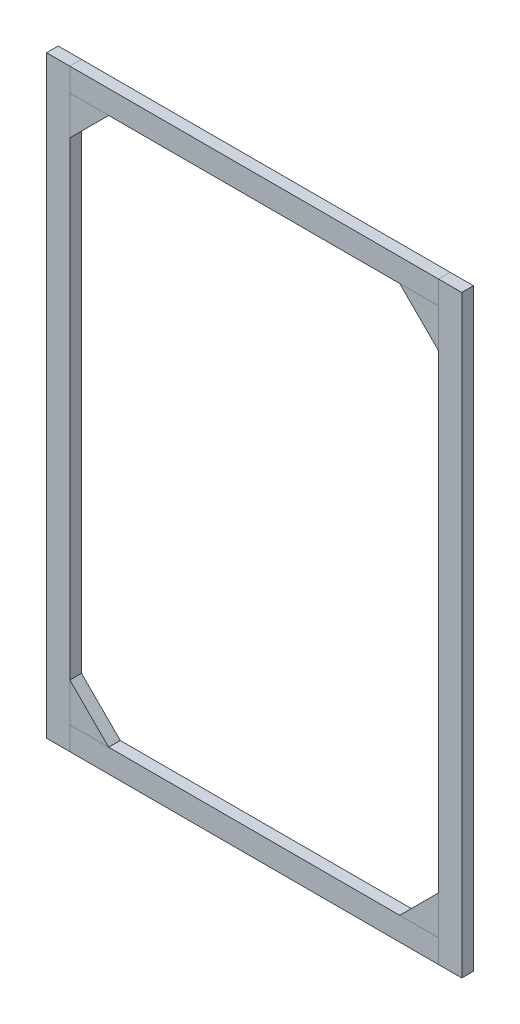
ISO-10303-21;
HEADER;
FILE_DESCRIPTION(('STEP AP214'),'2;1');
FILE_NAME('part.step','',(''),(''),'','','');
FILE_SCHEMA(('AUTOMOTIVE_DESIGN { 1 0 10303 214 1 1 1 1 }'));
ENDSEC;
DATA;
#1=APPLICATION_CONTEXT('core data for automotive mechanical design processes');
#2=APPLICATION_PROTOCOL_DEFINITION('international standard','automotive_design',2000,#1);
#3=PRODUCT_CONTEXT('',#1,'mechanical');
#4=PRODUCT('Part','Part','',(#3));
#5=PRODUCT_RELATED_PRODUCT_CATEGORY('part','',(#4));
#6=PRODUCT_DEFINITION_FORMATION('','',#4);
#7=PRODUCT_DEFINITION_CONTEXT('part definition',#1,'design');
#8=PRODUCT_DEFINITION('design','',#6,#7);
#9=PRODUCT_DEFINITION_SHAPE('','',#8);
#10=(LENGTH_UNIT() NAMED_UNIT(*) SI_UNIT(.MILLI.,.METRE.));
#11=(NAMED_UNIT(*) PLANE_ANGLE_UNIT() SI_UNIT($,.RADIAN.));
#12=(NAMED_UNIT(*) SI_UNIT($,.STERADIAN.) SOLID_ANGLE_UNIT());
#13=UNCERTAINTY_MEASURE_WITH_UNIT(LENGTH_MEASURE(1.E-05),#10,'distance_accuracy_value','');
#14=(GEOMETRIC_REPRESENTATION_CONTEXT(3) GLOBAL_UNCERTAINTY_ASSIGNED_CONTEXT((#13)) GLOBAL_UNIT_ASSIGNED_CONTEXT((#10,
#11,#12)) REPRESENTATION_CONTEXT('',''));
#15=CARTESIAN_POINT('',(0.,0.,0.));
#16=DIRECTION('',(0.,0.,1.));
#17=DIRECTION('',(1.,0.,0.));
#18=AXIS2_PLACEMENT_3D('',#15,#16,#17);
#19=CARTESIAN_POINT('',(375.,-705.,-15.));
#20=DIRECTION('',(0.707106781186548,-0.707106781186547,0.));
#21=DIRECTION('',(0.707106781186547,0.707106781186548,0.));
#22=AXIS2_PLACEMENT_3D('',#19,#20,#21);
#23=PLANE('',#22);
#24=DIRECTION('',(0.707106781186547,0.707106781186548,0.));
#25=VECTOR('',#24,1.);
#26=CARTESIAN_POINT('',(375.,-705.,15.));
#27=LINE('',#26,#25);
#28=CARTESIAN_POINT('',(375.,-705.,15.));
#29=VERTEX_POINT('',#28);
#30=CARTESIAN_POINT('',(475.,-605.,14.9999999999981));
#31=VERTEX_POINT('',#30);
#32=EDGE_CURVE('E118',#29,#31,#27,.T.);
#33=ORIENTED_EDGE('',*,*,#32,.T.);
#34=DIRECTION('',(0.,0.,1.));
#35=VECTOR('',#34,1.);
#36=CARTESIAN_POINT('',(475.,-605.,-15.0000000000019));
#37=LINE('',#36,#35);
#38=CARTESIAN_POINT('',(475.,-605.,-15.0000000000019));
#39=VERTEX_POINT('',#38);
#40=EDGE_CURVE('E13',#39,#31,#37,.T.);
#41=ORIENTED_EDGE('',*,*,#40,.F.);
#42=DIRECTION('',(0.707106781186547,0.707106781186548,0.));
#43=VECTOR('',#42,1.);
#44=CARTESIAN_POINT('',(375.,-705.,-15.));
#45=LINE('',#44,#43);
#46=CARTESIAN_POINT('',(375.,-705.,-15.));
#47=VERTEX_POINT('',#46);
#48=EDGE_CURVE('E112',#47,#39,#45,.T.);
#49=ORIENTED_EDGE('',*,*,#48,.F.);
#50=DIRECTION('',(0.,0.,1.));
#51=VECTOR('',#50,1.);
#52=CARTESIAN_POINT('',(375.,-705.,-15.));
#53=LINE('',#52,#51);
#54=EDGE_CURVE('E119',#47,#29,#53,.T.);
#55=ORIENTED_EDGE('',*,*,#54,.T.);
#56=EDGE_LOOP('',(#33,#41,#49,#55));
#57=FACE_BOUND('',#56,.T.);
#58=ADVANCED_FACE('F71',(#57),#23,.F.);
#59=CARTESIAN_POINT('',(475.,-705.,-15.));
#60=DIRECTION('',(-1.,0.,0.));
#61=DIRECTION('',(0.,-1.,0.));
#62=AXIS2_PLACEMENT_3D('',#59,#60,#61);
#63=PLANE('',#62);
#64=DIRECTION('',(0.,-1.,0.));
#65=VECTOR('',#64,1.);
#66=CARTESIAN_POINT('',(475.,-705.,15.));
#67=LINE('',#66,#65);
#68=CARTESIAN_POINT('',(475.,-705.,15.));
#69=VERTEX_POINT('',#68);
#70=EDGE_CURVE('E120',#31,#69,#67,.T.);
#71=ORIENTED_EDGE('',*,*,#70,.T.);
#72=DIRECTION('',(0.,0.,1.));
#73=VECTOR('',#72,1.);
#74=CARTESIAN_POINT('',(475.,-705.,-15.));
#75=LINE('',#74,#73);
#76=CARTESIAN_POINT('',(475.,-705.,-15.));
#77=VERTEX_POINT('',#76);
#78=EDGE_CURVE('E79',#77,#69,#75,.T.);
#79=ORIENTED_EDGE('',*,*,#78,.F.);
#80=DIRECTION('',(0.,-1.,0.));
#81=VECTOR('',#80,1.);
#82=CARTESIAN_POINT('',(475.,-705.,-15.));
#83=LINE('',#82,#81);
#84=EDGE_CURVE('E107',#39,#77,#83,.T.);
#85=ORIENTED_EDGE('',*,*,#84,.F.);
#86=ORIENTED_EDGE('',*,*,#40,.T.);
#87=EDGE_LOOP('',(#71,#79,#85,#86));
#88=FACE_BOUND('',#87,.T.);
#89=ADVANCED_FACE('F109',(#88),#63,.F.);
#90=CARTESIAN_POINT('',(475.,-705.,-15.));
#91=DIRECTION('',(0.,1.,0.));
#92=DIRECTION('',(0.,0.,-1.));
#93=AXIS2_PLACEMENT_3D('',#90,#91,#92);
#94=PLANE('',#93);
#95=DIRECTION('',(-1.,0.,0.));
#96=VECTOR('',#95,1.);
#97=CARTESIAN_POINT('',(475.,-705.,15.));
#98=LINE('',#97,#96);
#99=EDGE_CURVE('E100',#69,#29,#98,.T.);
#100=ORIENTED_EDGE('',*,*,#99,.T.);
#101=ORIENTED_EDGE('',*,*,#54,.F.);
#102=DIRECTION('',(-1.,0.,0.));
#103=VECTOR('',#102,1.);
#104=CARTESIAN_POINT('',(475.,-705.,-15.));
#105=LINE('',#104,#103);
#106=EDGE_CURVE('E87',#77,#47,#105,.T.);
#107=ORIENTED_EDGE('',*,*,#106,.F.);
#108=ORIENTED_EDGE('',*,*,#78,.T.);
#109=EDGE_LOOP('',(#100,#101,#107,#108));
#110=FACE_BOUND('',#109,.T.);
#111=ADVANCED_FACE('F126',(#110),#94,.F.);
#112=CARTESIAN_POINT('',(0.,-2.77469019982732E-13,-15.000000000013));
#113=DIRECTION('',(0.,0.,1.));
#114=DIRECTION('',(0.,1.,0.));
#115=AXIS2_PLACEMENT_3D('',#112,#113,#114);
#116=PLANE('',#115);
#117=ORIENTED_EDGE('',*,*,#48,.T.);
#118=ORIENTED_EDGE('',*,*,#84,.T.);
#119=ORIENTED_EDGE('',*,*,#106,.T.);
#120=EDGE_LOOP('',(#117,#118,#119));
#121=FACE_BOUND('',#120,.T.);
#122=ADVANCED_FACE('F115',(#121),#116,.F.);
#123=CARTESIAN_POINT('',(0.,2.77642492329846E-13,14.999999999987));
#124=DIRECTION('',(0.,0.,1.));
#125=DIRECTION('',(0.,1.,0.));
#126=AXIS2_PLACEMENT_3D('',#123,#124,#125);
#127=PLANE('',#126);
#128=ORIENTED_EDGE('',*,*,#32,.F.);
#129=ORIENTED_EDGE('',*,*,#99,.F.);
#130=ORIENTED_EDGE('',*,*,#70,.F.);
#131=EDGE_LOOP('',(#128,#129,#130));
#132=FACE_BOUND('',#131,.T.);
#133=ADVANCED_FACE('F127',(#132),#127,.T.);
#134=CLOSED_SHELL('',(#58,#89,#111,#122,#133));
#135=MANIFOLD_SOLID_BREP('B2',#134);
#136=CARTESIAN_POINT('',(-375.,-705.,-15.));
#137=DIRECTION('',(-0.707106781186548,-0.707106781186547,0.));
#138=DIRECTION('',(-0.707106781186547,0.707106781186548,0.));
#139=AXIS2_PLACEMENT_3D('',#136,#137,#138);
#140=PLANE('',#139);
#141=DIRECTION('',(-0.707106781186547,0.707106781186548,0.));
#142=VECTOR('',#141,1.);
#143=CARTESIAN_POINT('',(-375.,-705.,15.));
#144=LINE('',#143,#142);
#145=CARTESIAN_POINT('',(-375.,-705.,15.));
#146=VERTEX_POINT('',#145);
#147=CARTESIAN_POINT('',(-475.,-605.,14.9999999999981));
#148=VERTEX_POINT('',#147);
#149=EDGE_CURVE('E231',#146,#148,#144,.T.);
#150=ORIENTED_EDGE('',*,*,#149,.F.);
#151=DIRECTION('',(0.,0.,1.));
#152=VECTOR('',#151,1.);
#153=CARTESIAN_POINT('',(-375.,-705.,-15.));
#154=LINE('',#153,#152);
#155=CARTESIAN_POINT('',(-375.,-705.,-15.));
#156=VERTEX_POINT('',#155);
#157=EDGE_CURVE('E226',#156,#146,#154,.T.);
#158=ORIENTED_EDGE('',*,*,#157,.F.);
#159=DIRECTION('',(-0.707106781186547,0.707106781186548,0.));
#160=VECTOR('',#159,1.);
#161=CARTESIAN_POINT('',(-375.,-705.,-15.));
#162=LINE('',#161,#160);
#163=CARTESIAN_POINT('',(-475.,-605.,-15.0000000000019));
#164=VERTEX_POINT('',#163);
#165=EDGE_CURVE('E218',#156,#164,#162,.T.);
#166=ORIENTED_EDGE('',*,*,#165,.T.);
#167=DIRECTION('',(0.,0.,1.));
#168=VECTOR('',#167,1.);
#169=CARTESIAN_POINT('',(-475.,-605.,-15.0000000000019));
#170=LINE('',#169,#168);
#171=EDGE_CURVE('E69',#164,#148,#170,.T.);
#172=ORIENTED_EDGE('',*,*,#171,.T.);
#173=EDGE_LOOP('',(#150,#158,#166,#172));
#174=FACE_BOUND('',#173,.T.);
#175=ADVANCED_FACE('F179',(#174),#140,.F.);
#176=CARTESIAN_POINT('',(-475.,-705.,-15.));
#177=DIRECTION('',(1.,0.,0.));
#178=DIRECTION('',(0.,-1.,0.));
#179=AXIS2_PLACEMENT_3D('',#176,#177,#178);
#180=PLANE('',#179);
#181=DIRECTION('',(0.,-1.,0.));
#182=VECTOR('',#181,1.);
#183=CARTESIAN_POINT('',(-475.,-705.,15.));
#184=LINE('',#183,#182);
#185=CARTESIAN_POINT('',(-475.,-705.,15.));
#186=VERTEX_POINT('',#185);
#187=EDGE_CURVE('E223',#148,#186,#184,.T.);
#188=ORIENTED_EDGE('',*,*,#187,.F.);
#189=ORIENTED_EDGE('',*,*,#171,.F.);
#190=DIRECTION('',(0.,-1.,0.));
#191=VECTOR('',#190,1.);
#192=CARTESIAN_POINT('',(-475.,-705.,-15.));
#193=LINE('',#192,#191);
#194=CARTESIAN_POINT('',(-475.,-705.,-15.));
#195=VERTEX_POINT('',#194);
#196=EDGE_CURVE('E214',#164,#195,#193,.T.);
#197=ORIENTED_EDGE('',*,*,#196,.T.);
#198=DIRECTION('',(0.,0.,1.));
#199=VECTOR('',#198,1.);
#200=CARTESIAN_POINT('',(-475.,-705.,-15.));
#201=LINE('',#200,#199);
#202=EDGE_CURVE('E187',#195,#186,#201,.T.);
#203=ORIENTED_EDGE('',*,*,#202,.T.);
#204=EDGE_LOOP('',(#188,#189,#197,#203));
#205=FACE_BOUND('',#204,.T.);
#206=ADVANCED_FACE('F222',(#205),#180,.F.);
#207=CARTESIAN_POINT('',(-475.,-705.,-15.));
#208=DIRECTION('',(0.,1.,0.));
#209=DIRECTION('',(0.,0.,-1.));
#210=AXIS2_PLACEMENT_3D('',#207,#208,#209);
#211=PLANE('',#210);
#212=DIRECTION('',(1.,0.,0.));
#213=VECTOR('',#212,1.);
#214=CARTESIAN_POINT('',(-475.,-705.,15.));
#215=LINE('',#214,#213);
#216=EDGE_CURVE('E206',#186,#146,#215,.T.);
#217=ORIENTED_EDGE('',*,*,#216,.F.);
#218=ORIENTED_EDGE('',*,*,#202,.F.);
#219=DIRECTION('',(1.,0.,0.));
#220=VECTOR('',#219,1.);
#221=CARTESIAN_POINT('',(-475.,-705.,-15.));
#222=LINE('',#221,#220);
#223=EDGE_CURVE('E195',#195,#156,#222,.T.);
#224=ORIENTED_EDGE('',*,*,#223,.T.);
#225=ORIENTED_EDGE('',*,*,#157,.T.);
#226=EDGE_LOOP('',(#217,#218,#224,#225));
#227=FACE_BOUND('',#226,.T.);
#228=ADVANCED_FACE('F240',(#227),#211,.F.);
#229=CARTESIAN_POINT('',(0.,-2.77469019982732E-13,-15.000000000013));
#230=DIRECTION('',(0.,0.,1.));
#231=DIRECTION('',(0.,1.,0.));
#232=AXIS2_PLACEMENT_3D('',#229,#230,#231);
#233=PLANE('',#232);
#234=ORIENTED_EDGE('',*,*,#165,.F.);
#235=ORIENTED_EDGE('',*,*,#223,.F.);
#236=ORIENTED_EDGE('',*,*,#196,.F.);
#237=EDGE_LOOP('',(#234,#235,#236));
#238=FACE_BOUND('',#237,.T.);
#239=ADVANCED_FACE('F216',(#238),#233,.F.);
#240=CARTESIAN_POINT('',(0.,2.77642492329846E-13,14.999999999987));
#241=DIRECTION('',(0.,0.,1.));
#242=DIRECTION('',(0.,1.,0.));
#243=AXIS2_PLACEMENT_3D('',#240,#241,#242);
#244=PLANE('',#243);
#245=ORIENTED_EDGE('',*,*,#149,.T.);
#246=ORIENTED_EDGE('',*,*,#187,.T.);
#247=ORIENTED_EDGE('',*,*,#216,.T.);
#248=EDGE_LOOP('',(#245,#246,#247));
#249=FACE_BOUND('',#248,.T.);
#250=ADVANCED_FACE('F234',(#249),#244,.T.);
#251=CLOSED_SHELL('',(#175,#206,#228,#239,#250));
#252=MANIFOLD_SOLID_BREP('B7',#251);
#253=CARTESIAN_POINT('',(375.,705.,-15.));
#254=DIRECTION('',(0.707106781186548,0.707106781186547,0.));
#255=DIRECTION('',(0.707106781186547,-0.707106781186548,0.));
#256=AXIS2_PLACEMENT_3D('',#253,#254,#255);
#257=PLANE('',#256);
#258=DIRECTION('',(0.707106781186547,-0.707106781186548,0.));
#259=VECTOR('',#258,1.);
#260=CARTESIAN_POINT('',(375.,705.,15.));
#261=LINE('',#260,#259);
#262=CARTESIAN_POINT('',(375.,705.,15.));
#263=VERTEX_POINT('',#262);
#264=CARTESIAN_POINT('',(475.,605.,14.9999999999981));
#265=VERTEX_POINT('',#264);
#266=EDGE_CURVE('E339',#263,#265,#261,.T.);
#267=ORIENTED_EDGE('',*,*,#266,.F.);
#268=DIRECTION('',(0.,0.,1.));
#269=VECTOR('',#268,1.);
#270=CARTESIAN_POINT('',(375.,705.,-15.));
#271=LINE('',#270,#269);
#272=CARTESIAN_POINT('',(375.,705.,-15.));
#273=VERTEX_POINT('',#272);
#274=EDGE_CURVE('E334',#273,#263,#271,.T.);
#275=ORIENTED_EDGE('',*,*,#274,.F.);
#276=DIRECTION('',(0.707106781186547,-0.707106781186548,0.));
#277=VECTOR('',#276,1.);
#278=CARTESIAN_POINT('',(375.,705.,-15.));
#279=LINE('',#278,#277);
#280=CARTESIAN_POINT('',(475.,605.,-15.0000000000019));
#281=VERTEX_POINT('',#280);
#282=EDGE_CURVE('E326',#273,#281,#279,.T.);
#283=ORIENTED_EDGE('',*,*,#282,.T.);
#284=DIRECTION('',(0.,0.,1.));
#285=VECTOR('',#284,1.);
#286=CARTESIAN_POINT('',(475.,605.,-15.0000000000019));
#287=LINE('',#286,#285);
#288=EDGE_CURVE('E177',#281,#265,#287,.T.);
#289=ORIENTED_EDGE('',*,*,#288,.T.);
#290=EDGE_LOOP('',(#267,#275,#283,#289));
#291=FACE_BOUND('',#290,.T.);
#292=ADVANCED_FACE('F287',(#291),#257,.F.);
#293=CARTESIAN_POINT('',(475.,705.,-15.));
#294=DIRECTION('',(-1.,0.,0.));
#295=DIRECTION('',(0.,1.,0.));
#296=AXIS2_PLACEMENT_3D('',#293,#294,#295);
#297=PLANE('',#296);
#298=DIRECTION('',(0.,1.,0.));
#299=VECTOR('',#298,1.);
#300=CARTESIAN_POINT('',(475.,705.,15.));
#301=LINE('',#300,#299);
#302=CARTESIAN_POINT('',(475.,705.,15.));
#303=VERTEX_POINT('',#302);
#304=EDGE_CURVE('E331',#265,#303,#301,.T.);
#305=ORIENTED_EDGE('',*,*,#304,.F.);
#306=ORIENTED_EDGE('',*,*,#288,.F.);
#307=DIRECTION('',(0.,1.,0.));
#308=VECTOR('',#307,1.);
#309=CARTESIAN_POINT('',(475.,705.,-15.));
#310=LINE('',#309,#308);
#311=CARTESIAN_POINT('',(475.,705.,-15.));
#312=VERTEX_POINT('',#311);
#313=EDGE_CURVE('E322',#281,#312,#310,.T.);
#314=ORIENTED_EDGE('',*,*,#313,.T.);
#315=DIRECTION('',(0.,0.,1.));
#316=VECTOR('',#315,1.);
#317=CARTESIAN_POINT('',(475.,705.,-15.));
#318=LINE('',#317,#316);
#319=EDGE_CURVE('E295',#312,#303,#318,.T.);
#320=ORIENTED_EDGE('',*,*,#319,.T.);
#321=EDGE_LOOP('',(#305,#306,#314,#320));
#322=FACE_BOUND('',#321,.T.);
#323=ADVANCED_FACE('F330',(#322),#297,.F.);
#324=CARTESIAN_POINT('',(475.,705.,-15.));
#325=DIRECTION('',(0.,-1.,0.));
#326=DIRECTION('',(0.,0.,-1.));
#327=AXIS2_PLACEMENT_3D('',#324,#325,#326);
#328=PLANE('',#327);
#329=DIRECTION('',(-1.,0.,0.));
#330=VECTOR('',#329,1.);
#331=CARTESIAN_POINT('',(475.,705.,15.));
#332=LINE('',#331,#330);
#333=EDGE_CURVE('E314',#303,#263,#332,.T.);
#334=ORIENTED_EDGE('',*,*,#333,.F.);
#335=ORIENTED_EDGE('',*,*,#319,.F.);
#336=DIRECTION('',(-1.,0.,0.));
#337=VECTOR('',#336,1.);
#338=CARTESIAN_POINT('',(475.,705.,-15.));
#339=LINE('',#338,#337);
#340=EDGE_CURVE('E303',#312,#273,#339,.T.);
#341=ORIENTED_EDGE('',*,*,#340,.T.);
#342=ORIENTED_EDGE('',*,*,#274,.T.);
#343=EDGE_LOOP('',(#334,#335,#341,#342));
#344=FACE_BOUND('',#343,.T.);
#345=ADVANCED_FACE('F348',(#344),#328,.F.);
#346=CARTESIAN_POINT('',(0.,2.77469019982732E-13,-15.000000000013));
#347=DIRECTION('',(0.,0.,1.));
#348=DIRECTION('',(0.,-1.,0.));
#349=AXIS2_PLACEMENT_3D('',#346,#347,#348);
#350=PLANE('',#349);
#351=ORIENTED_EDGE('',*,*,#282,.F.);
#352=ORIENTED_EDGE('',*,*,#340,.F.);
#353=ORIENTED_EDGE('',*,*,#313,.F.);
#354=EDGE_LOOP('',(#351,#352,#353));
#355=FACE_BOUND('',#354,.T.);
#356=ADVANCED_FACE('F324',(#355),#350,.F.);
#357=CARTESIAN_POINT('',(0.,-2.77642492329846E-13,14.999999999987));
#358=DIRECTION('',(0.,0.,1.));
#359=DIRECTION('',(0.,-1.,0.));
#360=AXIS2_PLACEMENT_3D('',#357,#358,#359);
#361=PLANE('',#360);
#362=ORIENTED_EDGE('',*,*,#266,.T.);
#363=ORIENTED_EDGE('',*,*,#304,.T.);
#364=ORIENTED_EDGE('',*,*,#333,.T.);
#365=EDGE_LOOP('',(#362,#363,#364));
#366=FACE_BOUND('',#365,.T.);
#367=ADVANCED_FACE('F342',(#366),#361,.T.);
#368=CLOSED_SHELL('',(#292,#323,#345,#356,#367));
#369=MANIFOLD_SOLID_BREP('B63',#368);
#370=CARTESIAN_POINT('',(-375.,705.,-15.));
#371=DIRECTION('',(-0.707106781186548,0.707106781186547,0.));
#372=DIRECTION('',(-0.707106781186547,-0.707106781186548,0.));
#373=AXIS2_PLACEMENT_3D('',#370,#371,#372);
#374=PLANE('',#373);
#375=DIRECTION('',(-0.707106781186547,-0.707106781186548,0.));
#376=VECTOR('',#375,1.);
#377=CARTESIAN_POINT('',(-375.,705.,15.));
#378=LINE('',#377,#376);
#379=CARTESIAN_POINT('',(-375.,705.,15.));
#380=VERTEX_POINT('',#379);
#381=CARTESIAN_POINT('',(-475.,605.,14.9999999999981));
#382=VERTEX_POINT('',#381);
#383=EDGE_CURVE('E442',#380,#382,#378,.T.);
#384=ORIENTED_EDGE('',*,*,#383,.T.);
#385=DIRECTION('',(0.,0.,1.));
#386=VECTOR('',#385,1.);
#387=CARTESIAN_POINT('',(-475.,605.,-15.0000000000019));
#388=LINE('',#387,#386);
#389=CARTESIAN_POINT('',(-475.,605.,-15.0000000000019));
#390=VERTEX_POINT('',#389);
#391=EDGE_CURVE('E285',#390,#382,#388,.T.);
#392=ORIENTED_EDGE('',*,*,#391,.F.);
#393=DIRECTION('',(-0.707106781186547,-0.707106781186548,0.));
#394=VECTOR('',#393,1.);
#395=CARTESIAN_POINT('',(-375.,705.,-15.));
#396=LINE('',#395,#394);
#397=CARTESIAN_POINT('',(-375.,705.,-15.));
#398=VERTEX_POINT('',#397);
#399=EDGE_CURVE('E435',#398,#390,#396,.T.);
#400=ORIENTED_EDGE('',*,*,#399,.F.);
#401=DIRECTION('',(0.,0.,1.));
#402=VECTOR('',#401,1.);
#403=CARTESIAN_POINT('',(-375.,705.,-15.));
#404=LINE('',#403,#402);
#405=EDGE_CURVE('E443',#398,#380,#404,.T.);
#406=ORIENTED_EDGE('',*,*,#405,.T.);
#407=EDGE_LOOP('',(#384,#392,#400,#406));
#408=FACE_BOUND('',#407,.T.);
#409=ADVANCED_FACE('F395',(#408),#374,.F.);
#410=CARTESIAN_POINT('',(-475.,705.,-15.));
#411=DIRECTION('',(1.,0.,0.));
#412=DIRECTION('',(0.,1.,0.));
#413=AXIS2_PLACEMENT_3D('',#410,#411,#412);
#414=PLANE('',#413);
#415=DIRECTION('',(0.,1.,0.));
#416=VECTOR('',#415,1.);
#417=CARTESIAN_POINT('',(-475.,705.,15.));
#418=LINE('',#417,#416);
#419=CARTESIAN_POINT('',(-475.,705.,15.));
#420=VERTEX_POINT('',#419);
#421=EDGE_CURVE('E423',#382,#420,#418,.T.);
#422=ORIENTED_EDGE('',*,*,#421,.T.);
#423=DIRECTION('',(0.,0.,1.));
#424=VECTOR('',#423,1.);
#425=CARTESIAN_POINT('',(-475.,705.,-15.));
#426=LINE('',#425,#424);
#427=CARTESIAN_POINT('',(-475.,705.,-15.));
#428=VERTEX_POINT('',#427);
#429=EDGE_CURVE('E403',#428,#420,#426,.T.);
#430=ORIENTED_EDGE('',*,*,#429,.F.);
#431=DIRECTION('',(0.,1.,0.));
#432=VECTOR('',#431,1.);
#433=CARTESIAN_POINT('',(-475.,705.,-15.));
#434=LINE('',#433,#432);
#435=EDGE_CURVE('E431',#390,#428,#434,.T.);
#436=ORIENTED_EDGE('',*,*,#435,.F.);
#437=ORIENTED_EDGE('',*,*,#391,.T.);
#438=EDGE_LOOP('',(#422,#430,#436,#437));
#439=FACE_BOUND('',#438,.T.);
#440=ADVANCED_FACE('F432',(#439),#414,.F.);
#441=CARTESIAN_POINT('',(-475.,705.,-15.));
#442=DIRECTION('',(0.,-1.,0.));
#443=DIRECTION('',(0.,0.,-1.));
#444=AXIS2_PLACEMENT_3D('',#441,#442,#443);
#445=PLANE('',#444);
#446=DIRECTION('',(1.,0.,0.));
#447=VECTOR('',#446,1.);
#448=CARTESIAN_POINT('',(-475.,705.,15.));
#449=LINE('',#448,#447);
#450=EDGE_CURVE('E428',#420,#380,#449,.T.);
#451=ORIENTED_EDGE('',*,*,#450,.T.);
#452=ORIENTED_EDGE('',*,*,#405,.F.);
#453=DIRECTION('',(1.,0.,0.));
#454=VECTOR('',#453,1.);
#455=CARTESIAN_POINT('',(-475.,705.,-15.));
#456=LINE('',#455,#454);
#457=EDGE_CURVE('E411',#428,#398,#456,.T.);
#458=ORIENTED_EDGE('',*,*,#457,.F.);
#459=ORIENTED_EDGE('',*,*,#429,.T.);
#460=EDGE_LOOP('',(#451,#452,#458,#459));
#461=FACE_BOUND('',#460,.T.);
#462=ADVANCED_FACE('F450',(#461),#445,.F.);
#463=CARTESIAN_POINT('',(0.,2.77469019982732E-13,-15.000000000013));
#464=DIRECTION('',(0.,0.,1.));
#465=DIRECTION('',(0.,-1.,0.));
#466=AXIS2_PLACEMENT_3D('',#463,#464,#465);
#467=PLANE('',#466);
#468=ORIENTED_EDGE('',*,*,#399,.T.);
#469=ORIENTED_EDGE('',*,*,#435,.T.);
#470=ORIENTED_EDGE('',*,*,#457,.T.);
#471=EDGE_LOOP('',(#468,#469,#470));
#472=FACE_BOUND('',#471,.T.);
#473=ADVANCED_FACE('F438',(#472),#467,.F.);
#474=CARTESIAN_POINT('',(0.,-2.77642492329846E-13,14.999999999987));
#475=DIRECTION('',(0.,0.,1.));
#476=DIRECTION('',(0.,-1.,0.));
#477=AXIS2_PLACEMENT_3D('',#474,#475,#476);
#478=PLANE('',#477);
#479=ORIENTED_EDGE('',*,*,#383,.F.);
#480=ORIENTED_EDGE('',*,*,#450,.F.);
#481=ORIENTED_EDGE('',*,*,#421,.F.);
#482=EDGE_LOOP('',(#479,#480,#481));
#483=FACE_BOUND('',#482,.T.);
#484=ADVANCED_FACE('F451',(#483),#478,.T.);
#485=CLOSED_SHELL('',(#409,#440,#462,#473,#484));
#486=MANIFOLD_SOLID_BREP('B171',#485);
#487=CARTESIAN_POINT('',(475.,-735.,-15.));
#488=DIRECTION('',(1.,0.,0.));
#489=DIRECTION('',(0.,0.,-1.));
#490=AXIS2_PLACEMENT_3D('',#487,#488,#489);
#491=PLANE('',#490);
#492=DIRECTION('',(0.,0.,1.));
#493=VECTOR('',#492,1.);
#494=CARTESIAN_POINT('',(475.,765.,15.));
#495=LINE('',#494,#493);
#496=CARTESIAN_POINT('',(475.,765.000000000001,-15.));
#497=VERTEX_POINT('',#496);
#498=CARTESIAN_POINT('',(475.,765.000000000001,15.));
#499=VERTEX_POINT('',#498);
#500=EDGE_CURVE('E557',#497,#499,#495,.T.);
#501=ORIENTED_EDGE('',*,*,#500,.T.);
#502=DIRECTION('',(0.,1.,0.));
#503=VECTOR('',#502,1.);
#504=CARTESIAN_POINT('',(475.,-735.,15.));
#505=LINE('',#504,#503);
#506=CARTESIAN_POINT('',(475.,705.,15.));
#507=VERTEX_POINT('',#506);
#508=EDGE_CURVE('E572',#507,#499,#505,.T.);
#509=ORIENTED_EDGE('',*,*,#508,.F.);
#510=DIRECTION('',(0.,0.,-1.));
#511=VECTOR('',#510,1.);
#512=CARTESIAN_POINT('',(475.,705.,-15.));
#513=LINE('',#512,#511);
#514=CARTESIAN_POINT('',(475.,705.,-15.));
#515=VERTEX_POINT('',#514);
#516=EDGE_CURVE('E525',#507,#515,#513,.T.);
#517=ORIENTED_EDGE('',*,*,#516,.T.);
#518=DIRECTION('',(0.,1.,0.));
#519=VECTOR('',#518,1.);
#520=CARTESIAN_POINT('',(475.,705.,-15.));
#521=LINE('',#520,#519);
#522=EDGE_CURVE('E511',#515,#497,#521,.T.);
#523=ORIENTED_EDGE('',*,*,#522,.T.);
#524=EDGE_LOOP('',(#501,#509,#517,#523));
#525=FACE_BOUND('',#524,.T.);
#526=ADVANCED_FACE('F503',(#525),#491,.T.);
#527=CARTESIAN_POINT('',(505.,765.,15.));
#528=DIRECTION('',(0.,-1.,0.));
#529=DIRECTION('',(1.,0.,0.));
#530=AXIS2_PLACEMENT_3D('',#527,#528,#529);
#531=PLANE('',#530);
#532=DIRECTION('',(0.,0.,-1.));
#533=VECTOR('',#532,1.);
#534=CARTESIAN_POINT('',(-475.,765.,15.));
#535=LINE('',#534,#533);
#536=CARTESIAN_POINT('',(-475.,765.,15.));
#537=VERTEX_POINT('',#536);
#538=CARTESIAN_POINT('',(-475.,765.,-15.));
#539=VERTEX_POINT('',#538);
#540=EDGE_CURVE('E393',#537,#539,#535,.T.);
#541=ORIENTED_EDGE('',*,*,#540,.F.);
#542=DIRECTION('',(-1.,0.,0.));
#543=VECTOR('',#542,1.);
#544=CARTESIAN_POINT('',(505.,765.,15.));
#545=LINE('',#544,#543);
#546=EDGE_CURVE('E566',#499,#537,#545,.T.);
#547=ORIENTED_EDGE('',*,*,#546,.F.);
#548=ORIENTED_EDGE('',*,*,#500,.F.);
#549=DIRECTION('',(-1.,0.,0.));
#550=VECTOR('',#549,1.);
#551=CARTESIAN_POINT('',(505.,765.,-15.));
#552=LINE('',#551,#550);
#553=EDGE_CURVE('E552',#497,#539,#552,.T.);
#554=ORIENTED_EDGE('',*,*,#553,.T.);
#555=EDGE_LOOP('',(#541,#547,#548,#554));
#556=FACE_BOUND('',#555,.T.);
#557=ADVANCED_FACE('F505',(#556),#531,.F.);
#558=CARTESIAN_POINT('',(505.,765.,15.));
#559=DIRECTION('',(0.,0.,-1.));
#560=DIRECTION('',(-1.,0.,0.));
#561=AXIS2_PLACEMENT_3D('',#558,#559,#560);
#562=PLANE('',#561);
#563=DIRECTION('',(0.,-1.,0.));
#564=VECTOR('',#563,1.);
#565=CARTESIAN_POINT('',(-475.,735.,15.));
#566=LINE('',#565,#564);
#567=CARTESIAN_POINT('',(-475.,704.999999999999,15.));
#568=VERTEX_POINT('',#567);
#569=EDGE_CURVE('E517',#537,#568,#566,.T.);
#570=ORIENTED_EDGE('',*,*,#569,.T.);
#571=DIRECTION('',(-1.,0.,0.));
#572=VECTOR('',#571,1.);
#573=CARTESIAN_POINT('',(505.,705.,15.));
#574=LINE('',#573,#572);
#575=EDGE_CURVE('E559',#507,#568,#574,.T.);
#576=ORIENTED_EDGE('',*,*,#575,.F.);
#577=ORIENTED_EDGE('',*,*,#508,.T.);
#578=ORIENTED_EDGE('',*,*,#546,.T.);
#579=EDGE_LOOP('',(#570,#576,#577,#578));
#580=FACE_BOUND('',#579,.T.);
#581=ADVANCED_FACE('F577',(#580),#562,.F.);
#582=CARTESIAN_POINT('',(505.,705.,-15.));
#583=DIRECTION('',(0.,1.,0.));
#584=DIRECTION('',(-1.,0.,0.));
#585=AXIS2_PLACEMENT_3D('',#582,#583,#584);
#586=PLANE('',#585);
#587=DIRECTION('',(0.,0.,1.));
#588=VECTOR('',#587,1.);
#589=CARTESIAN_POINT('',(-475.,705.,-15.));
#590=LINE('',#589,#588);
#591=CARTESIAN_POINT('',(-475.,705.,-15.));
#592=VERTEX_POINT('',#591);
#593=EDGE_CURVE('E571',#592,#568,#590,.T.);
#594=ORIENTED_EDGE('',*,*,#593,.F.);
#595=DIRECTION('',(-1.,0.,0.));
#596=VECTOR('',#595,1.);
#597=CARTESIAN_POINT('',(505.,705.,-15.));
#598=LINE('',#597,#596);
#599=EDGE_CURVE('E554',#515,#592,#598,.T.);
#600=ORIENTED_EDGE('',*,*,#599,.F.);
#601=ORIENTED_EDGE('',*,*,#516,.F.);
#602=ORIENTED_EDGE('',*,*,#575,.T.);
#603=EDGE_LOOP('',(#594,#600,#601,#602));
#604=FACE_BOUND('',#603,.T.);
#605=ADVANCED_FACE('F569',(#604),#586,.F.);
#606=CARTESIAN_POINT('',(505.,705.,-15.));
#607=DIRECTION('',(0.,0.,1.));
#608=DIRECTION('',(0.,-1.,0.));
#609=AXIS2_PLACEMENT_3D('',#606,#607,#608);
#610=PLANE('',#609);
#611=DIRECTION('',(0.,-1.,0.));
#612=VECTOR('',#611,1.);
#613=CARTESIAN_POINT('',(-475.,735.,-15.));
#614=LINE('',#613,#612);
#615=EDGE_CURVE('E542',#539,#592,#614,.T.);
#616=ORIENTED_EDGE('',*,*,#615,.F.);
#617=ORIENTED_EDGE('',*,*,#553,.F.);
#618=ORIENTED_EDGE('',*,*,#522,.F.);
#619=ORIENTED_EDGE('',*,*,#599,.T.);
#620=EDGE_LOOP('',(#616,#617,#618,#619));
#621=FACE_BOUND('',#620,.T.);
#622=ADVANCED_FACE('F551',(#621),#610,.F.);
#623=CARTESIAN_POINT('',(-475.,735.,-15.));
#624=DIRECTION('',(-1.,0.,0.));
#625=DIRECTION('',(0.,-1.,0.));
#626=AXIS2_PLACEMENT_3D('',#623,#624,#625);
#627=PLANE('',#626);
#628=ORIENTED_EDGE('',*,*,#593,.T.);
#629=ORIENTED_EDGE('',*,*,#569,.F.);
#630=ORIENTED_EDGE('',*,*,#540,.T.);
#631=ORIENTED_EDGE('',*,*,#615,.T.);
#632=EDGE_LOOP('',(#628,#629,#630,#631));
#633=FACE_BOUND('',#632,.T.);
#634=ADVANCED_FACE('F541',(#633),#627,.T.);
#635=CLOSED_SHELL('',(#526,#557,#581,#605,#622,#634));
#636=MANIFOLD_SOLID_BREP('B279',#635);
#637=CARTESIAN_POINT('',(-535.,735.,15.));
#638=DIRECTION('',(1.,0.,0.));
#639=DIRECTION('',(0.,1.,0.));
#640=AXIS2_PLACEMENT_3D('',#637,#638,#639);
#641=PLANE('',#640);
#642=DIRECTION('',(0.,0.,1.));
#643=VECTOR('',#642,1.);
#644=CARTESIAN_POINT('',(-535.,765.,15.));
#645=LINE('',#644,#643);
#646=CARTESIAN_POINT('',(-535.000000000003,765.,-15.));
#647=VERTEX_POINT('',#646);
#648=CARTESIAN_POINT('',(-535.,765.,15.));
#649=VERTEX_POINT('',#648);
#650=EDGE_CURVE('E714',#647,#649,#645,.T.);
#651=ORIENTED_EDGE('',*,*,#650,.F.);
#652=DIRECTION('',(0.,-1.,0.));
#653=VECTOR('',#652,1.);
#654=CARTESIAN_POINT('',(-535.,735.,-15.));
#655=LINE('',#654,#653);
#656=CARTESIAN_POINT('',(-535.,-765.,-15.));
#657=VERTEX_POINT('',#656);
#658=EDGE_CURVE('E669',#647,#657,#655,.T.);
#659=ORIENTED_EDGE('',*,*,#658,.T.);
#660=DIRECTION('',(0.,0.,-1.));
#661=VECTOR('',#660,1.);
#662=CARTESIAN_POINT('',(-535.,-765.,15.));
#663=LINE('',#662,#661);
#664=CARTESIAN_POINT('',(-535.,-765.,15.));
#665=VERTEX_POINT('',#664);
#666=EDGE_CURVE('E718',#665,#657,#663,.T.);
#667=ORIENTED_EDGE('',*,*,#666,.F.);
#668=DIRECTION('',(0.,-1.,0.));
#669=VECTOR('',#668,1.);
#670=CARTESIAN_POINT('',(-535.,735.,15.));
#671=LINE('',#670,#669);
#672=EDGE_CURVE('E710',#649,#665,#671,.T.);
#673=ORIENTED_EDGE('',*,*,#672,.F.);
#674=EDGE_LOOP('',(#651,#659,#667,#673));
#675=FACE_BOUND('',#674,.T.);
#676=ADVANCED_FACE('F665',(#675),#641,.F.);
#677=CARTESIAN_POINT('',(-535.,735.,15.));
#678=DIRECTION('',(0.,0.,-1.));
#679=DIRECTION('',(-1.,0.,0.));
#680=AXIS2_PLACEMENT_3D('',#677,#678,#679);
#681=PLANE('',#680);
#682=DIRECTION('',(1.,0.,0.));
#683=VECTOR('',#682,1.);
#684=CARTESIAN_POINT('',(-535.,765.,15.));
#685=LINE('',#684,#683);
#686=CARTESIAN_POINT('',(-475.,765.,15.));
#687=VERTEX_POINT('',#686);
#688=EDGE_CURVE('E674',#649,#687,#685,.T.);
#689=ORIENTED_EDGE('',*,*,#688,.F.);
#690=ORIENTED_EDGE('',*,*,#672,.T.);
#691=DIRECTION('',(-1.,0.,0.));
#692=VECTOR('',#691,1.);
#693=CARTESIAN_POINT('',(-535.,-765.,15.));
#694=LINE('',#693,#692);
#695=CARTESIAN_POINT('',(-475.,-765.,15.));
#696=VERTEX_POINT('',#695);
#697=EDGE_CURVE('E726',#696,#665,#694,.T.);
#698=ORIENTED_EDGE('',*,*,#697,.F.);
#699=DIRECTION('',(0.,-1.,0.));
#700=VECTOR('',#699,1.);
#701=CARTESIAN_POINT('',(-475.,735.,15.));
#702=LINE('',#701,#700);
#703=EDGE_CURVE('E711',#687,#696,#702,.T.);
#704=ORIENTED_EDGE('',*,*,#703,.F.);
#705=EDGE_LOOP('',(#689,#690,#698,#704));
#706=FACE_BOUND('',#705,.T.);
#707=ADVANCED_FACE('F708',(#706),#681,.F.);
#708=CARTESIAN_POINT('',(-475.,735.,-15.));
#709=DIRECTION('',(-1.,0.,0.));
#710=DIRECTION('',(0.,-1.,0.));
#711=AXIS2_PLACEMENT_3D('',#708,#709,#710);
#712=PLANE('',#711);
#713=DIRECTION('',(0.,0.,-1.));
#714=VECTOR('',#713,1.);
#715=CARTESIAN_POINT('',(-475.,765.,-15.));
#716=LINE('',#715,#714);
#717=CARTESIAN_POINT('',(-475.,765.,-15.));
#718=VERTEX_POINT('',#717);
#719=EDGE_CURVE('E501',#687,#718,#716,.T.);
#720=ORIENTED_EDGE('',*,*,#719,.F.);
#721=ORIENTED_EDGE('',*,*,#703,.T.);
#722=DIRECTION('',(0.,0.,1.));
#723=VECTOR('',#722,1.);
#724=CARTESIAN_POINT('',(-475.,-765.,-15.));
#725=LINE('',#724,#723);
#726=CARTESIAN_POINT('',(-474.999999999998,-765.,-15.));
#727=VERTEX_POINT('',#726);
#728=EDGE_CURVE('E722',#727,#696,#725,.T.);
#729=ORIENTED_EDGE('',*,*,#728,.F.);
#730=DIRECTION('',(0.,-1.,0.));
#731=VECTOR('',#730,1.);
#732=CARTESIAN_POINT('',(-475.,735.,-15.));
#733=LINE('',#732,#731);
#734=EDGE_CURVE('E687',#718,#727,#733,.T.);
#735=ORIENTED_EDGE('',*,*,#734,.F.);
#736=EDGE_LOOP('',(#720,#721,#729,#735));
#737=FACE_BOUND('',#736,.T.);
#738=ADVANCED_FACE('F729',(#737),#712,.F.);
#739=CARTESIAN_POINT('',(-475.,735.,-15.));
#740=DIRECTION('',(0.,0.,1.));
#741=DIRECTION('',(1.,0.,0.));
#742=AXIS2_PLACEMENT_3D('',#739,#740,#741);
#743=PLANE('',#742);
#744=DIRECTION('',(-1.,0.,0.));
#745=VECTOR('',#744,1.);
#746=CARTESIAN_POINT('',(-475.,765.,-15.));
#747=LINE('',#746,#745);
#748=EDGE_CURVE('E720',#718,#647,#747,.T.);
#749=ORIENTED_EDGE('',*,*,#748,.F.);
#750=ORIENTED_EDGE('',*,*,#734,.T.);
#751=DIRECTION('',(1.,0.,0.));
#752=VECTOR('',#751,1.);
#753=CARTESIAN_POINT('',(-475.,-765.,-15.));
#754=LINE('',#753,#752);
#755=EDGE_CURVE('E735',#657,#727,#754,.T.);
#756=ORIENTED_EDGE('',*,*,#755,.F.);
#757=ORIENTED_EDGE('',*,*,#658,.F.);
#758=EDGE_LOOP('',(#749,#750,#756,#757));
#759=FACE_BOUND('',#758,.T.);
#760=ADVANCED_FACE('F739',(#759),#743,.F.);
#761=CARTESIAN_POINT('',(-505.,-765.,15.));
#762=DIRECTION('',(0.,-1.,0.));
#763=DIRECTION('',(1.,0.,0.));
#764=AXIS2_PLACEMENT_3D('',#761,#762,#763);
#765=PLANE('',#764);
#766=ORIENTED_EDGE('',*,*,#697,.T.);
#767=ORIENTED_EDGE('',*,*,#666,.T.);
#768=ORIENTED_EDGE('',*,*,#755,.T.);
#769=ORIENTED_EDGE('',*,*,#728,.T.);
#770=EDGE_LOOP('',(#766,#767,#768,#769));
#771=FACE_BOUND('',#770,.T.);
#772=ADVANCED_FACE('F734',(#771),#765,.T.);
#773=CARTESIAN_POINT('',(-505.,765.,-15.));
#774=DIRECTION('',(0.,1.,0.));
#775=DIRECTION('',(0.,0.,1.));
#776=AXIS2_PLACEMENT_3D('',#773,#774,#775);
#777=PLANE('',#776);
#778=ORIENTED_EDGE('',*,*,#748,.T.);
#779=ORIENTED_EDGE('',*,*,#650,.T.);
#780=ORIENTED_EDGE('',*,*,#688,.T.);
#781=ORIENTED_EDGE('',*,*,#719,.T.);
#782=EDGE_LOOP('',(#778,#779,#780,#781));
#783=FACE_BOUND('',#782,.T.);
#784=ADVANCED_FACE('F667',(#783),#777,.T.);
#785=CLOSED_SHELL('',(#676,#707,#738,#760,#772,#784));
#786=MANIFOLD_SOLID_BREP('B387',#785);
#787=CARTESIAN_POINT('',(535.,-735.,15.));
#788=DIRECTION('',(-1.,0.,0.));
#789=DIRECTION('',(0.,0.,1.));
#790=AXIS2_PLACEMENT_3D('',#787,#788,#789);
#791=PLANE('',#790);
#792=DIRECTION('',(0.,0.,-1.));
#793=VECTOR('',#792,1.);
#794=CARTESIAN_POINT('',(535.,765.,15.));
#795=LINE('',#794,#793);
#796=CARTESIAN_POINT('',(535.,765.,15.));
#797=VERTEX_POINT('',#796);
#798=CARTESIAN_POINT('',(535.,765.,-15.));
#799=VERTEX_POINT('',#798);
#800=EDGE_CURVE('E881',#797,#799,#795,.T.);
#801=ORIENTED_EDGE('',*,*,#800,.F.);
#802=DIRECTION('',(0.,1.,0.));
#803=VECTOR('',#802,1.);
#804=CARTESIAN_POINT('',(535.,-735.,15.));
#805=LINE('',#804,#803);
#806=CARTESIAN_POINT('',(535.,-765.,15.));
#807=VERTEX_POINT('',#806);
#808=EDGE_CURVE('E889',#807,#797,#805,.T.);
#809=ORIENTED_EDGE('',*,*,#808,.F.);
#810=DIRECTION('',(0.,0.,1.));
#811=VECTOR('',#810,1.);
#812=CARTESIAN_POINT('',(535.,-765.,15.));
#813=LINE('',#812,#811);
#814=CARTESIAN_POINT('',(535.,-765.,-15.));
#815=VERTEX_POINT('',#814);
#816=EDGE_CURVE('E873',#815,#807,#813,.T.);
#817=ORIENTED_EDGE('',*,*,#816,.F.);
#818=DIRECTION('',(0.,1.,0.));
#819=VECTOR('',#818,1.);
#820=CARTESIAN_POINT('',(535.,-735.,-15.));
#821=LINE('',#820,#819);
#822=EDGE_CURVE('E830',#815,#799,#821,.T.);
#823=ORIENTED_EDGE('',*,*,#822,.T.);
#824=EDGE_LOOP('',(#801,#809,#817,#823));
#825=FACE_BOUND('',#824,.T.);
#826=ADVANCED_FACE('F826',(#825),#791,.F.);
#827=CARTESIAN_POINT('',(535.,-735.,15.));
#828=DIRECTION('',(0.,0.,-1.));
#829=DIRECTION('',(-1.,0.,0.));
#830=AXIS2_PLACEMENT_3D('',#827,#828,#829);
#831=PLANE('',#830);
#832=DIRECTION('',(1.,0.,0.));
#833=VECTOR('',#832,1.);
#834=CARTESIAN_POINT('',(535.,765.,15.));
#835=LINE('',#834,#833);
#836=CARTESIAN_POINT('',(475.,765.,15.));
#837=VERTEX_POINT('',#836);
#838=EDGE_CURVE('E878',#837,#797,#835,.T.);
#839=ORIENTED_EDGE('',*,*,#838,.F.);
#840=DIRECTION('',(0.,1.,0.));
#841=VECTOR('',#840,1.);
#842=CARTESIAN_POINT('',(475.,-735.,15.));
#843=LINE('',#842,#841);
#844=CARTESIAN_POINT('',(475.,-765.,15.));
#845=VERTEX_POINT('',#844);
#846=EDGE_CURVE('E867',#845,#837,#843,.T.);
#847=ORIENTED_EDGE('',*,*,#846,.F.);
#848=DIRECTION('',(-1.,0.,0.));
#849=VECTOR('',#848,1.);
#850=CARTESIAN_POINT('',(535.,-765.,15.));
#851=LINE('',#850,#849);
#852=EDGE_CURVE('E877',#807,#845,#851,.T.);
#853=ORIENTED_EDGE('',*,*,#852,.F.);
#854=ORIENTED_EDGE('',*,*,#808,.T.);
#855=EDGE_LOOP('',(#839,#847,#853,#854));
#856=FACE_BOUND('',#855,.T.);
#857=ADVANCED_FACE('F900',(#856),#831,.F.);
#858=CARTESIAN_POINT('',(475.,-735.,-15.));
#859=DIRECTION('',(1.,0.,0.));
#860=DIRECTION('',(0.,0.,-1.));
#861=AXIS2_PLACEMENT_3D('',#858,#859,#860);
#862=PLANE('',#861);
#863=DIRECTION('',(0.,0.,1.));
#864=VECTOR('',#863,1.);
#865=CARTESIAN_POINT('',(475.,765.,-15.));
#866=LINE('',#865,#864);
#867=CARTESIAN_POINT('',(475.,765.,-15.));
#868=VERTEX_POINT('',#867);
#869=EDGE_CURVE('E663',#868,#837,#866,.T.);
#870=ORIENTED_EDGE('',*,*,#869,.F.);
#871=DIRECTION('',(0.,1.,0.));
#872=VECTOR('',#871,1.);
#873=CARTESIAN_POINT('',(475.,-735.,-15.));
#874=LINE('',#873,#872);
#875=CARTESIAN_POINT('',(475.,-765.,-15.));
#876=VERTEX_POINT('',#875);
#877=EDGE_CURVE('E843',#876,#868,#874,.T.);
#878=ORIENTED_EDGE('',*,*,#877,.F.);
#879=DIRECTION('',(0.,0.,-1.));
#880=VECTOR('',#879,1.);
#881=CARTESIAN_POINT('',(475.,-765.,-15.));
#882=LINE('',#881,#880);
#883=EDGE_CURVE('E863',#845,#876,#882,.T.);
#884=ORIENTED_EDGE('',*,*,#883,.F.);
#885=ORIENTED_EDGE('',*,*,#846,.T.);
#886=EDGE_LOOP('',(#870,#878,#884,#885));
#887=FACE_BOUND('',#886,.T.);
#888=ADVANCED_FACE('F860',(#887),#862,.F.);
#889=CARTESIAN_POINT('',(475.,-735.,-15.));
#890=DIRECTION('',(0.,0.,1.));
#891=DIRECTION('',(1.,0.,0.));
#892=AXIS2_PLACEMENT_3D('',#889,#890,#891);
#893=PLANE('',#892);
#894=DIRECTION('',(-1.,0.,0.));
#895=VECTOR('',#894,1.);
#896=CARTESIAN_POINT('',(475.,765.,-15.));
#897=LINE('',#896,#895);
#898=EDGE_CURVE('E835',#799,#868,#897,.T.);
#899=ORIENTED_EDGE('',*,*,#898,.F.);
#900=ORIENTED_EDGE('',*,*,#822,.F.);
#901=DIRECTION('',(1.,0.,0.));
#902=VECTOR('',#901,1.);
#903=CARTESIAN_POINT('',(475.,-765.,-15.));
#904=LINE('',#903,#902);
#905=EDGE_CURVE('E866',#876,#815,#904,.T.);
#906=ORIENTED_EDGE('',*,*,#905,.F.);
#907=ORIENTED_EDGE('',*,*,#877,.T.);
#908=EDGE_LOOP('',(#899,#900,#906,#907));
#909=FACE_BOUND('',#908,.T.);
#910=ADVANCED_FACE('F870',(#909),#893,.F.);
#911=CARTESIAN_POINT('',(505.,-765.,-15.));
#912=DIRECTION('',(0.,-1.,0.));
#913=DIRECTION('',(1.,0.,0.));
#914=AXIS2_PLACEMENT_3D('',#911,#912,#913);
#915=PLANE('',#914);
#916=ORIENTED_EDGE('',*,*,#905,.T.);
#917=ORIENTED_EDGE('',*,*,#816,.T.);
#918=ORIENTED_EDGE('',*,*,#852,.T.);
#919=ORIENTED_EDGE('',*,*,#883,.T.);
#920=EDGE_LOOP('',(#916,#917,#918,#919));
#921=FACE_BOUND('',#920,.T.);
#922=ADVANCED_FACE('F876',(#921),#915,.T.);
#923=CARTESIAN_POINT('',(505.,765.,15.));
#924=DIRECTION('',(0.,1.,0.));
#925=DIRECTION('',(0.,0.,1.));
#926=AXIS2_PLACEMENT_3D('',#923,#924,#925);
#927=PLANE('',#926);
#928=ORIENTED_EDGE('',*,*,#838,.T.);
#929=ORIENTED_EDGE('',*,*,#800,.T.);
#930=ORIENTED_EDGE('',*,*,#898,.T.);
#931=ORIENTED_EDGE('',*,*,#869,.T.);
#932=EDGE_LOOP('',(#928,#929,#930,#931));
#933=FACE_BOUND('',#932,.T.);
#934=ADVANCED_FACE('F828',(#933),#927,.T.);
#935=CLOSED_SHELL('',(#826,#857,#888,#910,#922,#934));
#936=MANIFOLD_SOLID_BREP('B495',#935);
#937=CARTESIAN_POINT('',(-475.,735.,-15.));
#938=DIRECTION('',(-1.,0.,0.));
#939=DIRECTION('',(0.,-1.,0.));
#940=AXIS2_PLACEMENT_3D('',#937,#938,#939);
#941=PLANE('',#940);
#942=DIRECTION('',(0.,0.,1.));
#943=VECTOR('',#942,1.);
#944=CARTESIAN_POINT('',(-475.,-765.,15.));
#945=LINE('',#944,#943);
#946=CARTESIAN_POINT('',(-475.,-765.000000000001,-15.));
#947=VERTEX_POINT('',#946);
#948=CARTESIAN_POINT('',(-475.,-765.000000000001,15.));
#949=VERTEX_POINT('',#948);
#950=EDGE_CURVE('E1032',#947,#949,#945,.T.);
#951=ORIENTED_EDGE('',*,*,#950,.T.);
#952=DIRECTION('',(0.,-1.,0.));
#953=VECTOR('',#952,1.);
#954=CARTESIAN_POINT('',(-475.,735.,15.));
#955=LINE('',#954,#953);
#956=CARTESIAN_POINT('',(-475.,-705.,15.));
#957=VERTEX_POINT('',#956);
#958=EDGE_CURVE('E1047',#957,#949,#955,.T.);
#959=ORIENTED_EDGE('',*,*,#958,.F.);
#960=DIRECTION('',(0.,0.,-1.));
#961=VECTOR('',#960,1.);
#962=CARTESIAN_POINT('',(-475.,-705.,-15.));
#963=LINE('',#962,#961);
#964=CARTESIAN_POINT('',(-475.,-705.,-15.));
#965=VERTEX_POINT('',#964);
#966=EDGE_CURVE('E1000',#957,#965,#963,.T.);
#967=ORIENTED_EDGE('',*,*,#966,.T.);
#968=DIRECTION('',(0.,-1.,0.));
#969=VECTOR('',#968,1.);
#970=CARTESIAN_POINT('',(-475.,-705.,-15.));
#971=LINE('',#970,#969);
#972=EDGE_CURVE('E986',#965,#947,#971,.T.);
#973=ORIENTED_EDGE('',*,*,#972,.T.);
#974=EDGE_LOOP('',(#951,#959,#967,#973));
#975=FACE_BOUND('',#974,.T.);
#976=ADVANCED_FACE('F978',(#975),#941,.T.);
#977=CARTESIAN_POINT('',(-505.,-765.,15.));
#978=DIRECTION('',(0.,1.,0.));
#979=DIRECTION('',(-1.,0.,0.));
#980=AXIS2_PLACEMENT_3D('',#977,#978,#979);
#981=PLANE('',#980);
#982=DIRECTION('',(0.,0.,-1.));
#983=VECTOR('',#982,1.);
#984=CARTESIAN_POINT('',(475.,-765.,15.));
#985=LINE('',#984,#983);
#986=CARTESIAN_POINT('',(475.,-765.,15.));
#987=VERTEX_POINT('',#986);
#988=CARTESIAN_POINT('',(475.,-765.,-15.));
#989=VERTEX_POINT('',#988);
#990=EDGE_CURVE('E824',#987,#989,#985,.T.);
#991=ORIENTED_EDGE('',*,*,#990,.F.);
#992=DIRECTION('',(1.,0.,0.));
#993=VECTOR('',#992,1.);
#994=CARTESIAN_POINT('',(-505.,-765.,15.));
#995=LINE('',#994,#993);
#996=EDGE_CURVE('E1041',#949,#987,#995,.T.);
#997=ORIENTED_EDGE('',*,*,#996,.F.);
#998=ORIENTED_EDGE('',*,*,#950,.F.);
#999=DIRECTION('',(1.,0.,0.));
#1000=VECTOR('',#999,1.);
#1001=CARTESIAN_POINT('',(-505.,-765.,-15.));
#1002=LINE('',#1001,#1000);
#1003=EDGE_CURVE('E1027',#947,#989,#1002,.T.);
#1004=ORIENTED_EDGE('',*,*,#1003,.T.);
#1005=EDGE_LOOP('',(#991,#997,#998,#1004));
#1006=FACE_BOUND('',#1005,.T.);
#1007=ADVANCED_FACE('F980',(#1006),#981,.F.);
#1008=CARTESIAN_POINT('',(-505.,-765.,15.));
#1009=DIRECTION('',(0.,0.,-1.));
#1010=DIRECTION('',(-1.,0.,0.));
#1011=AXIS2_PLACEMENT_3D('',#1008,#1009,#1010);
#1012=PLANE('',#1011);
#1013=DIRECTION('',(0.,1.,0.));
#1014=VECTOR('',#1013,1.);
#1015=CARTESIAN_POINT('',(475.,-735.,15.));
#1016=LINE('',#1015,#1014);
#1017=CARTESIAN_POINT('',(475.,-704.999999999999,15.));
#1018=VERTEX_POINT('',#1017);
#1019=EDGE_CURVE('E992',#987,#1018,#1016,.T.);
#1020=ORIENTED_EDGE('',*,*,#1019,.T.);
#1021=DIRECTION('',(1.,0.,0.));
#1022=VECTOR('',#1021,1.);
#1023=CARTESIAN_POINT('',(-505.,-705.,15.));
#1024=LINE('',#1023,#1022);
#1025=EDGE_CURVE('E1034',#957,#1018,#1024,.T.);
#1026=ORIENTED_EDGE('',*,*,#1025,.F.);
#1027=ORIENTED_EDGE('',*,*,#958,.T.);
#1028=ORIENTED_EDGE('',*,*,#996,.T.);
#1029=EDGE_LOOP('',(#1020,#1026,#1027,#1028));
#1030=FACE_BOUND('',#1029,.T.);
#1031=ADVANCED_FACE('F1052',(#1030),#1012,.F.);
#1032=CARTESIAN_POINT('',(-505.,-705.,-15.));
#1033=DIRECTION('',(0.,-1.,0.));
#1034=DIRECTION('',(1.,0.,0.));
#1035=AXIS2_PLACEMENT_3D('',#1032,#1033,#1034);
#1036=PLANE('',#1035);
#1037=DIRECTION('',(0.,0.,1.));
#1038=VECTOR('',#1037,1.);
#1039=CARTESIAN_POINT('',(475.,-705.,-15.));
#1040=LINE('',#1039,#1038);
#1041=CARTESIAN_POINT('',(475.,-705.,-15.));
#1042=VERTEX_POINT('',#1041);
#1043=EDGE_CURVE('E1046',#1042,#1018,#1040,.T.);
#1044=ORIENTED_EDGE('',*,*,#1043,.F.);
#1045=DIRECTION('',(1.,0.,0.));
#1046=VECTOR('',#1045,1.);
#1047=CARTESIAN_POINT('',(-505.,-705.,-15.));
#1048=LINE('',#1047,#1046);
#1049=EDGE_CURVE('E1029',#965,#1042,#1048,.T.);
#1050=ORIENTED_EDGE('',*,*,#1049,.F.);
#1051=ORIENTED_EDGE('',*,*,#966,.F.);
#1052=ORIENTED_EDGE('',*,*,#1025,.T.);
#1053=EDGE_LOOP('',(#1044,#1050,#1051,#1052));
#1054=FACE_BOUND('',#1053,.T.);
#1055=ADVANCED_FACE('F1044',(#1054),#1036,.F.);
#1056=CARTESIAN_POINT('',(-505.,-705.,-15.));
#1057=DIRECTION('',(0.,0.,1.));
#1058=DIRECTION('',(0.,-1.,0.));
#1059=AXIS2_PLACEMENT_3D('',#1056,#1057,#1058);
#1060=PLANE('',#1059);
#1061=DIRECTION('',(0.,1.,0.));
#1062=VECTOR('',#1061,1.);
#1063=CARTESIAN_POINT('',(475.,-735.,-15.));
#1064=LINE('',#1063,#1062);
#1065=EDGE_CURVE('E1017',#989,#1042,#1064,.T.);
#1066=ORIENTED_EDGE('',*,*,#1065,.F.);
#1067=ORIENTED_EDGE('',*,*,#1003,.F.);
#1068=ORIENTED_EDGE('',*,*,#972,.F.);
#1069=ORIENTED_EDGE('',*,*,#1049,.T.);
#1070=EDGE_LOOP('',(#1066,#1067,#1068,#1069));
#1071=FACE_BOUND('',#1070,.T.);
#1072=ADVANCED_FACE('F1026',(#1071),#1060,.F.);
#1073=CARTESIAN_POINT('',(475.,-735.,-15.));
#1074=DIRECTION('',(1.,0.,0.));
#1075=DIRECTION('',(0.,0.,-1.));
#1076=AXIS2_PLACEMENT_3D('',#1073,#1074,#1075);
#1077=PLANE('',#1076);
#1078=ORIENTED_EDGE('',*,*,#1043,.T.);
#1079=ORIENTED_EDGE('',*,*,#1019,.F.);
#1080=ORIENTED_EDGE('',*,*,#990,.T.);
#1081=ORIENTED_EDGE('',*,*,#1065,.T.);
#1082=EDGE_LOOP('',(#1078,#1079,#1080,#1081));
#1083=FACE_BOUND('',#1082,.T.);
#1084=ADVANCED_FACE('F1016',(#1083),#1077,.T.);
#1085=CLOSED_SHELL('',(#976,#1007,#1031,#1055,#1072,#1084));
#1086=MANIFOLD_SOLID_BREP('B657',#1085);
#1087=ADVANCED_BREP_SHAPE_REPRESENTATION('',(#18,#135,#252,#369,#486,#636,#786,#936,#1086),#14);
#1088=SHAPE_DEFINITION_REPRESENTATION(#9,#1087);
ENDSEC;
END-ISO-10303-21;
